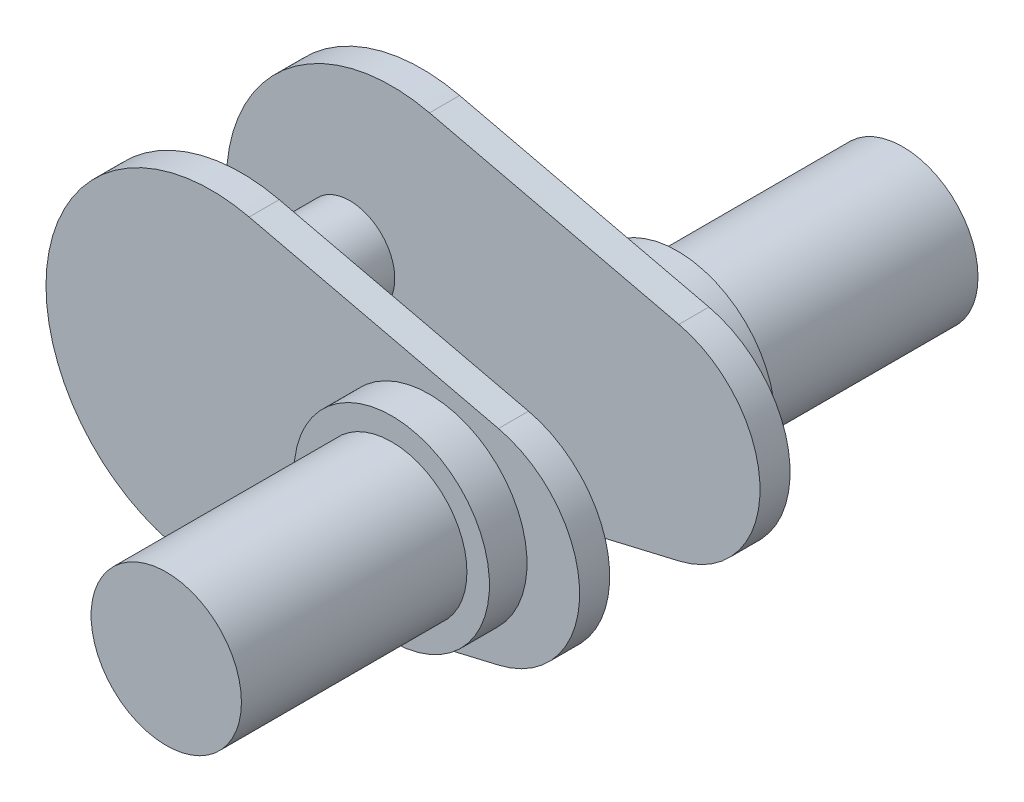
ISO-10303-21;
HEADER;
FILE_DESCRIPTION(('STEP AP214'),'2;1');
FILE_NAME('part.step','',(''),(''),'','','');
FILE_SCHEMA(('AUTOMOTIVE_DESIGN { 1 0 10303 214 1 1 1 1 }'));
ENDSEC;
DATA;
#1=APPLICATION_CONTEXT('core data for automotive mechanical design processes');
#2=APPLICATION_PROTOCOL_DEFINITION('international standard','automotive_design',2000,#1);
#3=PRODUCT_CONTEXT('',#1,'mechanical');
#4=PRODUCT('Part','Part','',(#3));
#5=PRODUCT_RELATED_PRODUCT_CATEGORY('part','',(#4));
#6=PRODUCT_DEFINITION_FORMATION('','',#4);
#7=PRODUCT_DEFINITION_CONTEXT('part definition',#1,'design');
#8=PRODUCT_DEFINITION('design','',#6,#7);
#9=PRODUCT_DEFINITION_SHAPE('','',#8);
#10=(LENGTH_UNIT() NAMED_UNIT(*) SI_UNIT(.MILLI.,.METRE.));
#11=(NAMED_UNIT(*) PLANE_ANGLE_UNIT() SI_UNIT($,.RADIAN.));
#12=(NAMED_UNIT(*) SI_UNIT($,.STERADIAN.) SOLID_ANGLE_UNIT());
#13=UNCERTAINTY_MEASURE_WITH_UNIT(LENGTH_MEASURE(1.E-05),#10,'distance_accuracy_value','');
#14=(GEOMETRIC_REPRESENTATION_CONTEXT(3) GLOBAL_UNCERTAINTY_ASSIGNED_CONTEXT((#13)) GLOBAL_UNIT_ASSIGNED_CONTEXT((#10,
#11,#12)) REPRESENTATION_CONTEXT('',''));
#15=CARTESIAN_POINT('',(0.,0.,0.));
#16=DIRECTION('',(0.,0.,1.));
#17=DIRECTION('',(1.,0.,0.));
#18=AXIS2_PLACEMENT_3D('',#15,#16,#17);
#19=CARTESIAN_POINT('',(6.,0.,-39.));
#20=DIRECTION('',(0.,0.,-1.));
#21=DIRECTION('',(-1.,0.,0.));
#22=AXIS2_PLACEMENT_3D('',#19,#20,#21);
#23=PLANE('',#22);
#24=CARTESIAN_POINT('',(6.,0.,-39.));
#25=DIRECTION('',(0.,0.,-1.));
#26=DIRECTION('',(-1.,0.,0.));
#27=AXIS2_PLACEMENT_3D('',#24,#25,#26);
#28=CIRCLE('',#27,14.);
#29=CARTESIAN_POINT('',(9.2,13.6293800299207,-39.));
#30=VERTEX_POINT('',#29);
#31=CARTESIAN_POINT('',(9.2,-13.6293800299207,-39.));
#32=VERTEX_POINT('',#31);
#33=EDGE_CURVE('E171',#30,#32,#28,.T.);
#34=ORIENTED_EDGE('',*,*,#33,.T.);
#35=DIRECTION('',(-0.973527144994333,-0.228571428571428,0.));
#36=VECTOR('',#35,1.);
#37=CARTESIAN_POINT('',(9.2,-13.6293800299207,-39.));
#38=LINE('',#37,#36);
#39=CARTESIAN_POINT('',(-23.9714285714286,-21.4175971898753,-39.));
#40=VERTEX_POINT('',#39);
#41=EDGE_CURVE('E173',#32,#40,#38,.T.);
#42=ORIENTED_EDGE('',*,*,#41,.T.);
#43=CARTESIAN_POINT('',(-29.,0.,-39.));
#44=DIRECTION('',(0.,0.,-1.));
#45=DIRECTION('',(-1.,0.,0.));
#46=AXIS2_PLACEMENT_3D('',#43,#44,#45);
#47=CIRCLE('',#46,22.);
#48=CARTESIAN_POINT('',(-23.9714285714286,21.4175971898753,-39.));
#49=VERTEX_POINT('',#48);
#50=EDGE_CURVE('E56',#40,#49,#47,.T.);
#51=ORIENTED_EDGE('',*,*,#50,.T.);
#52=DIRECTION('',(0.973527144994333,-0.228571428571429,0.));
#53=VECTOR('',#52,1.);
#54=CARTESIAN_POINT('',(9.2,13.6293800299207,-39.));
#55=LINE('',#54,#53);
#56=EDGE_CURVE('E51',#49,#30,#55,.T.);
#57=ORIENTED_EDGE('',*,*,#56,.T.);
#58=EDGE_LOOP('',(#34,#42,#51,#57));
#59=FACE_BOUND('',#58,.T.);
#60=CARTESIAN_POINT('',(-34.5895707422904,0.,-39.));
#61=DIRECTION('',(0.,0.,-1.));
#62=DIRECTION('',(-1.,0.,0.));
#63=AXIS2_PLACEMENT_3D('',#60,#61,#62);
#64=CIRCLE('',#63,5.99999999999999);
#65=CARTESIAN_POINT('',(-40.5895707422904,0.,-39.));
#66=VERTEX_POINT('',#65);
#67=EDGE_CURVE('E159',#66,#66,#64,.T.);
#68=ORIENTED_EDGE('',*,*,#67,.F.);
#69=EDGE_LOOP('',(#68));
#70=FACE_BOUND('',#69,.T.);
#71=ADVANCED_FACE('F36',(#59,#70),#23,.T.);
#72=CARTESIAN_POINT('',(0.,0.,-30.));
#73=DIRECTION('',(0.,0.,1.));
#74=DIRECTION('',(1.,0.,0.));
#75=AXIS2_PLACEMENT_3D('',#72,#73,#74);
#76=CYLINDRICAL_SURFACE('',#75,10.);
#77=CARTESIAN_POINT('',(0.,0.,-30.));
#78=DIRECTION('',(0.,0.,-1.));
#79=DIRECTION('',(-1.,0.,0.));
#80=AXIS2_PLACEMENT_3D('',#77,#78,#79);
#81=CIRCLE('',#80,10.);
#82=CARTESIAN_POINT('',(-10.,0.,-30.));
#83=VERTEX_POINT('',#82);
#84=EDGE_CURVE('E44',#83,#83,#81,.F.);
#85=ORIENTED_EDGE('',*,*,#84,.T.);
#86=EDGE_LOOP('',(#85));
#87=FACE_BOUND('',#86,.T.);
#88=CARTESIAN_POINT('',(0.,0.,0.));
#89=DIRECTION('',(0.,0.,1.));
#90=DIRECTION('',(1.,0.,0.));
#91=AXIS2_PLACEMENT_3D('',#88,#89,#90);
#92=CIRCLE('',#91,10.);
#93=CARTESIAN_POINT('',(10.,0.,0.));
#94=VERTEX_POINT('',#93);
#95=EDGE_CURVE('E11',#94,#94,#92,.T.);
#96=ORIENTED_EDGE('',*,*,#95,.F.);
#97=EDGE_LOOP('',(#96));
#98=FACE_BOUND('',#97,.T.);
#99=ADVANCED_FACE('F38',(#87,#98),#76,.T.);
#100=CARTESIAN_POINT('',(0.,0.,0.));
#101=DIRECTION('',(0.,0.,1.));
#102=DIRECTION('',(1.,0.,0.));
#103=AXIS2_PLACEMENT_3D('',#100,#101,#102);
#104=PLANE('',#103);
#105=ORIENTED_EDGE('',*,*,#95,.T.);
#106=EDGE_LOOP('',(#105));
#107=FACE_BOUND('',#106,.T.);
#108=ADVANCED_FACE('F208',(#107),#104,.T.);
#109=CARTESIAN_POINT('',(0.,0.,-35.));
#110=DIRECTION('',(0.,0.,1.));
#111=DIRECTION('',(1.,0.,0.));
#112=AXIS2_PLACEMENT_3D('',#109,#110,#111);
#113=CYLINDRICAL_SURFACE('',#112,13.);
#114=CARTESIAN_POINT('',(0.,0.,-35.));
#115=DIRECTION('',(0.,0.,-1.));
#116=DIRECTION('',(-1.,0.,0.));
#117=AXIS2_PLACEMENT_3D('',#114,#115,#116);
#118=CIRCLE('',#117,13.);
#119=CARTESIAN_POINT('',(-13.,0.,-35.));
#120=VERTEX_POINT('',#119);
#121=EDGE_CURVE('E192',#120,#120,#118,.T.);
#122=ORIENTED_EDGE('',*,*,#121,.F.);
#123=EDGE_LOOP('',(#122));
#124=FACE_BOUND('',#123,.T.);
#125=CARTESIAN_POINT('',(0.,0.,-30.));
#126=DIRECTION('',(0.,0.,-1.));
#127=DIRECTION('',(-1.,0.,0.));
#128=AXIS2_PLACEMENT_3D('',#125,#126,#127);
#129=CIRCLE('',#128,13.);
#130=CARTESIAN_POINT('',(-13.,0.,-30.));
#131=VERTEX_POINT('',#130);
#132=EDGE_CURVE('E189',#131,#131,#129,.T.);
#133=ORIENTED_EDGE('',*,*,#132,.T.);
#134=EDGE_LOOP('',(#133));
#135=FACE_BOUND('',#134,.T.);
#136=ADVANCED_FACE('F203',(#124,#135),#113,.T.);
#137=CARTESIAN_POINT('',(0.,0.,-30.));
#138=DIRECTION('',(0.,0.,-1.));
#139=DIRECTION('',(-1.,0.,0.));
#140=AXIS2_PLACEMENT_3D('',#137,#138,#139);
#141=PLANE('',#140);
#142=ORIENTED_EDGE('',*,*,#84,.F.);
#143=EDGE_LOOP('',(#142));
#144=FACE_BOUND('',#143,.T.);
#145=ORIENTED_EDGE('',*,*,#132,.F.);
#146=EDGE_LOOP('',(#145));
#147=FACE_BOUND('',#146,.T.);
#148=ADVANCED_FACE('F199',(#144,#147),#141,.F.);
#149=CARTESIAN_POINT('',(6.,0.,-35.));
#150=DIRECTION('',(0.,0.,-1.));
#151=DIRECTION('',(-1.,0.,0.));
#152=AXIS2_PLACEMENT_3D('',#149,#150,#151);
#153=PLANE('',#152);
#154=CARTESIAN_POINT('',(6.,0.,-35.));
#155=DIRECTION('',(0.,0.,-1.));
#156=DIRECTION('',(-1.,0.,0.));
#157=AXIS2_PLACEMENT_3D('',#154,#155,#156);
#158=CIRCLE('',#157,14.);
#159=CARTESIAN_POINT('',(9.2,13.6293800299207,-35.));
#160=VERTEX_POINT('',#159);
#161=CARTESIAN_POINT('',(9.2,-13.6293800299207,-35.));
#162=VERTEX_POINT('',#161);
#163=EDGE_CURVE('E162',#160,#162,#158,.T.);
#164=ORIENTED_EDGE('',*,*,#163,.F.);
#165=DIRECTION('',(0.973527144994333,-0.228571428571429,0.));
#166=VECTOR('',#165,1.);
#167=CARTESIAN_POINT('',(9.2,13.6293800299207,-35.));
#168=LINE('',#167,#166);
#169=CARTESIAN_POINT('',(-23.9714285714286,21.4175971898753,-35.));
#170=VERTEX_POINT('',#169);
#171=EDGE_CURVE('E169',#170,#160,#168,.T.);
#172=ORIENTED_EDGE('',*,*,#171,.F.);
#173=CARTESIAN_POINT('',(-29.,0.,-35.));
#174=DIRECTION('',(0.,0.,-1.));
#175=DIRECTION('',(-1.,0.,0.));
#176=AXIS2_PLACEMENT_3D('',#173,#174,#175);
#177=CIRCLE('',#176,22.);
#178=CARTESIAN_POINT('',(-23.9714285714286,-21.4175971898753,-35.));
#179=VERTEX_POINT('',#178);
#180=EDGE_CURVE('E167',#179,#170,#177,.T.);
#181=ORIENTED_EDGE('',*,*,#180,.F.);
#182=DIRECTION('',(-0.973527144994333,-0.228571428571428,0.));
#183=VECTOR('',#182,1.);
#184=CARTESIAN_POINT('',(9.2,-13.6293800299207,-35.));
#185=LINE('',#184,#183);
#186=EDGE_CURVE('E165',#162,#179,#185,.T.);
#187=ORIENTED_EDGE('',*,*,#186,.F.);
#188=EDGE_LOOP('',(#164,#172,#181,#187));
#189=FACE_BOUND('',#188,.T.);
#190=ORIENTED_EDGE('',*,*,#121,.T.);
#191=EDGE_LOOP('',(#190));
#192=FACE_BOUND('',#191,.T.);
#193=ADVANCED_FACE('F202',(#189,#192),#153,.F.);
#194=CARTESIAN_POINT('',(6.,0.,-39.));
#195=DIRECTION('',(0.,0.,1.));
#196=DIRECTION('',(1.,0.,0.));
#197=AXIS2_PLACEMENT_3D('',#194,#195,#196);
#198=CYLINDRICAL_SURFACE('',#197,14.);
#199=ORIENTED_EDGE('',*,*,#163,.T.);
#200=DIRECTION('',(0.,0.,1.));
#201=VECTOR('',#200,1.);
#202=CARTESIAN_POINT('',(9.2,-13.6293800299207,-39.));
#203=LINE('',#202,#201);
#204=EDGE_CURVE('E186',#32,#162,#203,.T.);
#205=ORIENTED_EDGE('',*,*,#204,.F.);
#206=ORIENTED_EDGE('',*,*,#33,.F.);
#207=DIRECTION('',(0.,0.,1.));
#208=VECTOR('',#207,1.);
#209=CARTESIAN_POINT('',(9.2,13.6293800299207,-39.));
#210=LINE('',#209,#208);
#211=EDGE_CURVE('E177',#30,#160,#210,.T.);
#212=ORIENTED_EDGE('',*,*,#211,.T.);
#213=EDGE_LOOP('',(#199,#205,#206,#212));
#214=FACE_BOUND('',#213,.T.);
#215=ADVANCED_FACE('F237',(#214),#198,.T.);
#216=CARTESIAN_POINT('',(9.2,-13.6293800299207,-39.));
#217=DIRECTION('',(-0.228571428571428,0.973527144994333,0.));
#218=DIRECTION('',(-0.973527144994333,-0.228571428571428,0.));
#219=AXIS2_PLACEMENT_3D('',#216,#217,#218);
#220=PLANE('',#219);
#221=ORIENTED_EDGE('',*,*,#186,.T.);
#222=DIRECTION('',(0.,0.,1.));
#223=VECTOR('',#222,1.);
#224=CARTESIAN_POINT('',(-23.9714285714286,-21.4175971898753,-39.));
#225=LINE('',#224,#223);
#226=EDGE_CURVE('E183',#40,#179,#225,.T.);
#227=ORIENTED_EDGE('',*,*,#226,.F.);
#228=ORIENTED_EDGE('',*,*,#41,.F.);
#229=ORIENTED_EDGE('',*,*,#204,.T.);
#230=EDGE_LOOP('',(#221,#227,#228,#229));
#231=FACE_BOUND('',#230,.T.);
#232=ADVANCED_FACE('F233',(#231),#220,.F.);
#233=CARTESIAN_POINT('',(-29.,0.,-39.));
#234=DIRECTION('',(0.,0.,1.));
#235=DIRECTION('',(1.,0.,0.));
#236=AXIS2_PLACEMENT_3D('',#233,#234,#235);
#237=CYLINDRICAL_SURFACE('',#236,22.);
#238=ORIENTED_EDGE('',*,*,#180,.T.);
#239=DIRECTION('',(0.,0.,1.));
#240=VECTOR('',#239,1.);
#241=CARTESIAN_POINT('',(-23.9714285714286,21.4175971898753,-39.));
#242=LINE('',#241,#240);
#243=EDGE_CURVE('E180',#49,#170,#242,.T.);
#244=ORIENTED_EDGE('',*,*,#243,.F.);
#245=ORIENTED_EDGE('',*,*,#50,.F.);
#246=ORIENTED_EDGE('',*,*,#226,.T.);
#247=EDGE_LOOP('',(#238,#244,#245,#246));
#248=FACE_BOUND('',#247,.T.);
#249=ADVANCED_FACE('F229',(#248),#237,.T.);
#250=CARTESIAN_POINT('',(9.2,13.6293800299207,-39.));
#251=DIRECTION('',(-0.228571428571429,-0.973527144994333,0.));
#252=DIRECTION('',(0.973527144994333,-0.228571428571429,0.));
#253=AXIS2_PLACEMENT_3D('',#250,#251,#252);
#254=PLANE('',#253);
#255=ORIENTED_EDGE('',*,*,#171,.T.);
#256=ORIENTED_EDGE('',*,*,#211,.F.);
#257=ORIENTED_EDGE('',*,*,#56,.F.);
#258=ORIENTED_EDGE('',*,*,#243,.T.);
#259=EDGE_LOOP('',(#255,#256,#257,#258));
#260=FACE_BOUND('',#259,.T.);
#261=ADVANCED_FACE('F225',(#260),#254,.F.);
#262=CARTESIAN_POINT('',(-34.5895707422904,0.,-49.));
#263=DIRECTION('',(0.,0.,1.));
#264=DIRECTION('',(1.,0.,0.));
#265=AXIS2_PLACEMENT_3D('',#262,#263,#264);
#266=CYLINDRICAL_SURFACE('',#265,5.99999999999999);
#267=ORIENTED_EDGE('',*,*,#67,.T.);
#268=EDGE_LOOP('',(#267));
#269=FACE_BOUND('',#268,.T.);
#270=CARTESIAN_POINT('',(-34.5895707422904,0.,-59.));
#271=DIRECTION('',(0.,0.,-1.));
#272=DIRECTION('',(-1.,0.,0.));
#273=AXIS2_PLACEMENT_3D('',#270,#271,#272);
#274=CIRCLE('',#273,5.99999999999999);
#275=CARTESIAN_POINT('',(-40.5895707422904,0.,-59.));
#276=VERTEX_POINT('',#275);
#277=EDGE_CURVE('E127',#276,#276,#274,.T.);
#278=ORIENTED_EDGE('',*,*,#277,.F.);
#279=EDGE_LOOP('',(#278));
#280=FACE_BOUND('',#279,.T.);
#281=ADVANCED_FACE('F228',(#269,#280),#266,.T.);
#282=CARTESIAN_POINT('',(6.,0.,-59.));
#283=DIRECTION('',(0.,0.,1.));
#284=DIRECTION('',(-1.,0.,0.));
#285=AXIS2_PLACEMENT_3D('',#282,#283,#284);
#286=PLANE('',#285);
#287=CARTESIAN_POINT('',(6.,0.,-59.));
#288=DIRECTION('',(0.,0.,-1.));
#289=DIRECTION('',(-1.,0.,0.));
#290=AXIS2_PLACEMENT_3D('',#287,#288,#289);
#291=CIRCLE('',#290,14.);
#292=CARTESIAN_POINT('',(9.2,13.6293800299207,-59.));
#293=VERTEX_POINT('',#292);
#294=CARTESIAN_POINT('',(9.2,-13.6293800299207,-59.));
#295=VERTEX_POINT('',#294);
#296=EDGE_CURVE('E107',#293,#295,#291,.T.);
#297=ORIENTED_EDGE('',*,*,#296,.F.);
#298=DIRECTION('',(0.973527144994333,-0.228571428571429,0.));
#299=VECTOR('',#298,1.);
#300=CARTESIAN_POINT('',(9.2,13.6293800299207,-59.));
#301=LINE('',#300,#299);
#302=CARTESIAN_POINT('',(-23.9714285714286,21.4175971898753,-59.));
#303=VERTEX_POINT('',#302);
#304=EDGE_CURVE('E140',#303,#293,#301,.T.);
#305=ORIENTED_EDGE('',*,*,#304,.F.);
#306=CARTESIAN_POINT('',(-29.,0.,-59.));
#307=DIRECTION('',(0.,0.,-1.));
#308=DIRECTION('',(-1.,0.,0.));
#309=AXIS2_PLACEMENT_3D('',#306,#307,#308);
#310=CIRCLE('',#309,22.);
#311=CARTESIAN_POINT('',(-23.9714285714286,-21.4175971898753,-59.));
#312=VERTEX_POINT('',#311);
#313=EDGE_CURVE('E137',#312,#303,#310,.T.);
#314=ORIENTED_EDGE('',*,*,#313,.F.);
#315=DIRECTION('',(-0.973527144994333,-0.228571428571428,0.));
#316=VECTOR('',#315,1.);
#317=CARTESIAN_POINT('',(9.2,-13.6293800299207,-59.));
#318=LINE('',#317,#316);
#319=EDGE_CURVE('E135',#295,#312,#318,.T.);
#320=ORIENTED_EDGE('',*,*,#319,.F.);
#321=EDGE_LOOP('',(#297,#305,#314,#320));
#322=FACE_BOUND('',#321,.T.);
#323=ORIENTED_EDGE('',*,*,#277,.T.);
#324=EDGE_LOOP('',(#323));
#325=FACE_BOUND('',#324,.T.);
#326=ADVANCED_FACE('F309',(#322,#325),#286,.T.);
#327=CARTESIAN_POINT('',(0.,0.,-68.));
#328=DIRECTION('',(0.,0.,-1.));
#329=DIRECTION('',(1.,0.,0.));
#330=AXIS2_PLACEMENT_3D('',#327,#328,#329);
#331=CYLINDRICAL_SURFACE('',#330,10.);
#332=CARTESIAN_POINT('',(0.,0.,-68.));
#333=DIRECTION('',(0.,0.,-1.));
#334=DIRECTION('',(-1.,0.,0.));
#335=AXIS2_PLACEMENT_3D('',#332,#333,#334);
#336=CIRCLE('',#335,10.);
#337=CARTESIAN_POINT('',(-10.,0.,-68.));
#338=VERTEX_POINT('',#337);
#339=EDGE_CURVE('E153',#338,#338,#336,.F.);
#340=ORIENTED_EDGE('',*,*,#339,.F.);
#341=EDGE_LOOP('',(#340));
#342=FACE_BOUND('',#341,.T.);
#343=CARTESIAN_POINT('',(0.,0.,-98.));
#344=DIRECTION('',(0.,0.,1.));
#345=DIRECTION('',(1.,0.,0.));
#346=AXIS2_PLACEMENT_3D('',#343,#344,#345);
#347=CIRCLE('',#346,10.);
#348=CARTESIAN_POINT('',(10.,0.,-98.));
#349=VERTEX_POINT('',#348);
#350=EDGE_CURVE('E156',#349,#349,#347,.T.);
#351=ORIENTED_EDGE('',*,*,#350,.T.);
#352=EDGE_LOOP('',(#351));
#353=FACE_BOUND('',#352,.T.);
#354=ADVANCED_FACE('F317',(#342,#353),#331,.T.);
#355=CARTESIAN_POINT('',(0.,0.,-98.));
#356=DIRECTION('',(0.,0.,-1.));
#357=DIRECTION('',(1.,0.,0.));
#358=AXIS2_PLACEMENT_3D('',#355,#356,#357);
#359=PLANE('',#358);
#360=ORIENTED_EDGE('',*,*,#350,.F.);
#361=EDGE_LOOP('',(#360));
#362=FACE_BOUND('',#361,.T.);
#363=ADVANCED_FACE('F326',(#362),#359,.T.);
#364=CARTESIAN_POINT('',(0.,0.,-63.));
#365=DIRECTION('',(0.,0.,-1.));
#366=DIRECTION('',(1.,0.,0.));
#367=AXIS2_PLACEMENT_3D('',#364,#365,#366);
#368=CYLINDRICAL_SURFACE('',#367,13.);
#369=CARTESIAN_POINT('',(0.,0.,-63.));
#370=DIRECTION('',(0.,0.,-1.));
#371=DIRECTION('',(-1.,0.,0.));
#372=AXIS2_PLACEMENT_3D('',#369,#370,#371);
#373=CIRCLE('',#372,13.);
#374=CARTESIAN_POINT('',(-13.,0.,-63.));
#375=VERTEX_POINT('',#374);
#376=EDGE_CURVE('E150',#375,#375,#373,.T.);
#377=ORIENTED_EDGE('',*,*,#376,.T.);
#378=EDGE_LOOP('',(#377));
#379=FACE_BOUND('',#378,.T.);
#380=CARTESIAN_POINT('',(0.,0.,-68.));
#381=DIRECTION('',(0.,0.,-1.));
#382=DIRECTION('',(-1.,0.,0.));
#383=AXIS2_PLACEMENT_3D('',#380,#381,#382);
#384=CIRCLE('',#383,13.);
#385=CARTESIAN_POINT('',(-13.,0.,-68.));
#386=VERTEX_POINT('',#385);
#387=EDGE_CURVE('E111',#386,#386,#384,.T.);
#388=ORIENTED_EDGE('',*,*,#387,.F.);
#389=EDGE_LOOP('',(#388));
#390=FACE_BOUND('',#389,.T.);
#391=ADVANCED_FACE('F335',(#379,#390),#368,.T.);
#392=CARTESIAN_POINT('',(0.,0.,-68.));
#393=DIRECTION('',(0.,0.,1.));
#394=DIRECTION('',(-1.,0.,0.));
#395=AXIS2_PLACEMENT_3D('',#392,#393,#394);
#396=PLANE('',#395);
#397=ORIENTED_EDGE('',*,*,#339,.T.);
#398=EDGE_LOOP('',(#397));
#399=FACE_BOUND('',#398,.T.);
#400=ORIENTED_EDGE('',*,*,#387,.T.);
#401=EDGE_LOOP('',(#400));
#402=FACE_BOUND('',#401,.T.);
#403=ADVANCED_FACE('F344',(#399,#402),#396,.F.);
#404=CARTESIAN_POINT('',(6.,0.,-63.));
#405=DIRECTION('',(0.,0.,1.));
#406=DIRECTION('',(-1.,0.,0.));
#407=AXIS2_PLACEMENT_3D('',#404,#405,#406);
#408=PLANE('',#407);
#409=CARTESIAN_POINT('',(6.,0.,-63.));
#410=DIRECTION('',(0.,0.,-1.));
#411=DIRECTION('',(-1.,0.,0.));
#412=AXIS2_PLACEMENT_3D('',#409,#410,#411);
#413=CIRCLE('',#412,14.);
#414=CARTESIAN_POINT('',(9.2,13.6293800299207,-63.));
#415=VERTEX_POINT('',#414);
#416=CARTESIAN_POINT('',(9.2,-13.6293800299207,-63.));
#417=VERTEX_POINT('',#416);
#418=EDGE_CURVE('E105',#415,#417,#413,.T.);
#419=ORIENTED_EDGE('',*,*,#418,.T.);
#420=DIRECTION('',(-0.973527144994333,-0.228571428571428,0.));
#421=VECTOR('',#420,1.);
#422=CARTESIAN_POINT('',(9.2,-13.6293800299207,-63.));
#423=LINE('',#422,#421);
#424=CARTESIAN_POINT('',(-23.9714285714286,-21.4175971898753,-63.));
#425=VERTEX_POINT('',#424);
#426=EDGE_CURVE('E115',#417,#425,#423,.T.);
#427=ORIENTED_EDGE('',*,*,#426,.T.);
#428=CARTESIAN_POINT('',(-29.,0.,-63.));
#429=DIRECTION('',(0.,0.,-1.));
#430=DIRECTION('',(-1.,0.,0.));
#431=AXIS2_PLACEMENT_3D('',#428,#429,#430);
#432=CIRCLE('',#431,22.);
#433=CARTESIAN_POINT('',(-23.9714285714286,21.4175971898753,-63.));
#434=VERTEX_POINT('',#433);
#435=EDGE_CURVE('E120',#425,#434,#432,.T.);
#436=ORIENTED_EDGE('',*,*,#435,.T.);
#437=DIRECTION('',(0.973527144994333,-0.228571428571429,0.));
#438=VECTOR('',#437,1.);
#439=CARTESIAN_POINT('',(9.2,13.6293800299207,-63.));
#440=LINE('',#439,#438);
#441=EDGE_CURVE('E126',#434,#415,#440,.T.);
#442=ORIENTED_EDGE('',*,*,#441,.T.);
#443=EDGE_LOOP('',(#419,#427,#436,#442));
#444=FACE_BOUND('',#443,.T.);
#445=ORIENTED_EDGE('',*,*,#376,.F.);
#446=EDGE_LOOP('',(#445));
#447=FACE_BOUND('',#446,.T.);
#448=ADVANCED_FACE('F123',(#444,#447),#408,.F.);
#449=CARTESIAN_POINT('',(6.,0.,-59.));
#450=DIRECTION('',(0.,0.,-1.));
#451=DIRECTION('',(1.,0.,0.));
#452=AXIS2_PLACEMENT_3D('',#449,#450,#451);
#453=CYLINDRICAL_SURFACE('',#452,14.);
#454=ORIENTED_EDGE('',*,*,#418,.F.);
#455=DIRECTION('',(0.,0.,-1.));
#456=VECTOR('',#455,1.);
#457=CARTESIAN_POINT('',(9.2,13.6293800299207,-59.));
#458=LINE('',#457,#456);
#459=EDGE_CURVE('E143',#293,#415,#458,.T.);
#460=ORIENTED_EDGE('',*,*,#459,.F.);
#461=ORIENTED_EDGE('',*,*,#296,.T.);
#462=DIRECTION('',(0.,0.,-1.));
#463=VECTOR('',#462,1.);
#464=CARTESIAN_POINT('',(9.2,-13.6293800299207,-59.));
#465=LINE('',#464,#463);
#466=EDGE_CURVE('E101',#295,#417,#465,.T.);
#467=ORIENTED_EDGE('',*,*,#466,.T.);
#468=EDGE_LOOP('',(#454,#460,#461,#467));
#469=FACE_BOUND('',#468,.T.);
#470=ADVANCED_FACE('F103',(#469),#453,.T.);
#471=CARTESIAN_POINT('',(9.2,-13.6293800299207,-59.));
#472=DIRECTION('',(-0.228571428571428,0.973527144994333,0.));
#473=DIRECTION('',(-0.973527144994333,-0.228571428571428,0.));
#474=AXIS2_PLACEMENT_3D('',#471,#472,#473);
#475=PLANE('',#474);
#476=ORIENTED_EDGE('',*,*,#426,.F.);
#477=ORIENTED_EDGE('',*,*,#466,.F.);
#478=ORIENTED_EDGE('',*,*,#319,.T.);
#479=DIRECTION('',(0.,0.,-1.));
#480=VECTOR('',#479,1.);
#481=CARTESIAN_POINT('',(-23.9714285714286,-21.4175971898753,-59.));
#482=LINE('',#481,#480);
#483=EDGE_CURVE('E112',#312,#425,#482,.T.);
#484=ORIENTED_EDGE('',*,*,#483,.T.);
#485=EDGE_LOOP('',(#476,#477,#478,#484));
#486=FACE_BOUND('',#485,.T.);
#487=ADVANCED_FACE('F116',(#486),#475,.F.);
#488=CARTESIAN_POINT('',(-29.,0.,-59.));
#489=DIRECTION('',(0.,0.,-1.));
#490=DIRECTION('',(1.,0.,0.));
#491=AXIS2_PLACEMENT_3D('',#488,#489,#490);
#492=CYLINDRICAL_SURFACE('',#491,22.);
#493=ORIENTED_EDGE('',*,*,#435,.F.);
#494=ORIENTED_EDGE('',*,*,#483,.F.);
#495=ORIENTED_EDGE('',*,*,#313,.T.);
#496=DIRECTION('',(0.,0.,-1.));
#497=VECTOR('',#496,1.);
#498=CARTESIAN_POINT('',(-23.9714285714286,21.4175971898753,-59.));
#499=LINE('',#498,#497);
#500=EDGE_CURVE('E145',#303,#434,#499,.T.);
#501=ORIENTED_EDGE('',*,*,#500,.T.);
#502=EDGE_LOOP('',(#493,#494,#495,#501));
#503=FACE_BOUND('',#502,.T.);
#504=ADVANCED_FACE('F375',(#503),#492,.T.);
#505=CARTESIAN_POINT('',(9.2,13.6293800299207,-59.));
#506=DIRECTION('',(-0.228571428571429,-0.973527144994333,0.));
#507=DIRECTION('',(0.973527144994333,-0.228571428571429,0.));
#508=AXIS2_PLACEMENT_3D('',#505,#506,#507);
#509=PLANE('',#508);
#510=ORIENTED_EDGE('',*,*,#441,.F.);
#511=ORIENTED_EDGE('',*,*,#500,.F.);
#512=ORIENTED_EDGE('',*,*,#304,.T.);
#513=ORIENTED_EDGE('',*,*,#459,.T.);
#514=EDGE_LOOP('',(#510,#511,#512,#513));
#515=FACE_BOUND('',#514,.T.);
#516=ADVANCED_FACE('F383',(#515),#509,.F.);
#517=CLOSED_SHELL('',(#71,#99,#108,#136,#148,#193,#215,#232,#249,#261,#281,#326,#354,#363,#391,
#403,#448,#470,#487,#504,#516));
#518=MANIFOLD_SOLID_BREP('B2',#517);
#519=ADVANCED_BREP_SHAPE_REPRESENTATION('',(#18,#518),#14);
#520=SHAPE_DEFINITION_REPRESENTATION(#9,#519);
ENDSEC;
END-ISO-10303-21;
